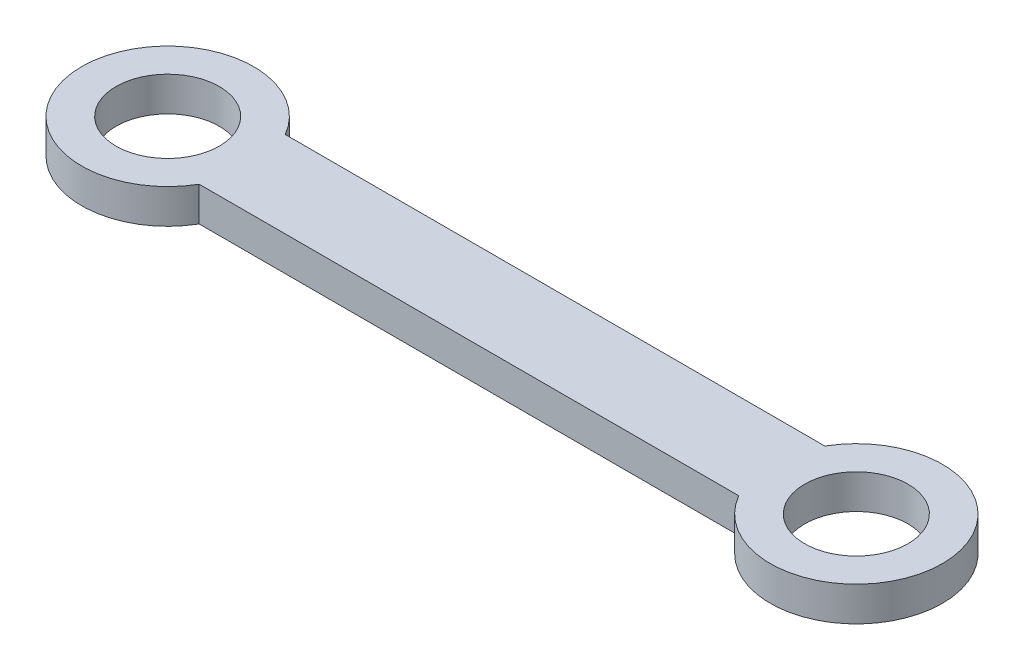
ISO-10303-21;
HEADER;
FILE_DESCRIPTION(('STEP AP214'),'2;1');
FILE_NAME('part.step','',(''),(''),'','','');
FILE_SCHEMA(('AUTOMOTIVE_DESIGN { 1 0 10303 214 1 1 1 1 }'));
ENDSEC;
DATA;
#1=APPLICATION_CONTEXT('core data for automotive mechanical design processes');
#2=APPLICATION_PROTOCOL_DEFINITION('international standard','automotive_design',2000,#1);
#3=PRODUCT_CONTEXT('',#1,'mechanical');
#4=PRODUCT('Part','Part','',(#3));
#5=PRODUCT_RELATED_PRODUCT_CATEGORY('part','',(#4));
#6=PRODUCT_DEFINITION_FORMATION('','',#4);
#7=PRODUCT_DEFINITION_CONTEXT('part definition',#1,'design');
#8=PRODUCT_DEFINITION('design','',#6,#7);
#9=PRODUCT_DEFINITION_SHAPE('','',#8);
#10=(LENGTH_UNIT() NAMED_UNIT(*) SI_UNIT(.MILLI.,.METRE.));
#11=(NAMED_UNIT(*) PLANE_ANGLE_UNIT() SI_UNIT($,.RADIAN.));
#12=(NAMED_UNIT(*) SI_UNIT($,.STERADIAN.) SOLID_ANGLE_UNIT());
#13=UNCERTAINTY_MEASURE_WITH_UNIT(LENGTH_MEASURE(1.E-05),#10,'distance_accuracy_value','');
#14=(GEOMETRIC_REPRESENTATION_CONTEXT(3) GLOBAL_UNCERTAINTY_ASSIGNED_CONTEXT((#13)) GLOBAL_UNIT_ASSIGNED_CONTEXT((#10,
#11,#12)) REPRESENTATION_CONTEXT('',''));
#15=CARTESIAN_POINT('',(0.,0.,0.));
#16=DIRECTION('',(0.,0.,1.));
#17=DIRECTION('',(1.,0.,0.));
#18=AXIS2_PLACEMENT_3D('',#15,#16,#17);
#19=CARTESIAN_POINT('',(-20.,2.,0.));
#20=DIRECTION('',(0.,1.,0.));
#21=DIRECTION('',(0.,0.,1.));
#22=AXIS2_PLACEMENT_3D('',#19,#20,#21);
#23=PLANE('',#22);
#24=CARTESIAN_POINT('',(-20.,2.,0.));
#25=DIRECTION('',(0.,1.,0.));
#26=DIRECTION('',(0.,0.,1.));
#27=AXIS2_PLACEMENT_3D('',#24,#25,#26);
#28=CIRCLE('',#27,3.);
#29=CARTESIAN_POINT('',(-20.,2.,3.));
#30=VERTEX_POINT('',#29);
#31=EDGE_CURVE('E116',#30,#30,#28,.T.);
#32=ORIENTED_EDGE('',*,*,#31,.F.);
#33=EDGE_LOOP('',(#32));
#34=FACE_BOUND('',#33,.T.);
#35=CARTESIAN_POINT('',(-20.,2.,0.));
#36=DIRECTION('',(0.,1.,0.));
#37=DIRECTION('',(0.,0.,1.));
#38=AXIS2_PLACEMENT_3D('',#35,#36,#37);
#39=CIRCLE('',#38,5.);
#40=CARTESIAN_POINT('',(-15.6698729810778,2.,-2.5));
#41=VERTEX_POINT('',#40);
#42=CARTESIAN_POINT('',(-15.6698729810778,2.,2.5));
#43=VERTEX_POINT('',#42);
#44=EDGE_CURVE('E96',#41,#43,#39,.T.);
#45=ORIENTED_EDGE('',*,*,#44,.T.);
#46=DIRECTION('',(1.,0.,0.));
#47=VECTOR('',#46,1.);
#48=CARTESIAN_POINT('',(15.6698729810778,2.,2.5));
#49=LINE('',#48,#47);
#50=CARTESIAN_POINT('',(15.6698729810778,2.,2.5));
#51=VERTEX_POINT('',#50);
#52=EDGE_CURVE('E91',#43,#51,#49,.T.);
#53=ORIENTED_EDGE('',*,*,#52,.T.);
#54=CARTESIAN_POINT('',(20.,2.,0.));
#55=DIRECTION('',(0.,1.,0.));
#56=DIRECTION('',(0.,0.,-1.));
#57=AXIS2_PLACEMENT_3D('',#54,#55,#56);
#58=CIRCLE('',#57,5.);
#59=CARTESIAN_POINT('',(15.6698729810778,2.,-2.5));
#60=VERTEX_POINT('',#59);
#61=EDGE_CURVE('E94',#51,#60,#58,.T.);
#62=ORIENTED_EDGE('',*,*,#61,.T.);
#63=DIRECTION('',(-1.,0.,0.));
#64=VECTOR('',#63,1.);
#65=CARTESIAN_POINT('',(15.6698729810778,2.,-2.5));
#66=LINE('',#65,#64);
#67=EDGE_CURVE('E61',#60,#41,#66,.T.);
#68=ORIENTED_EDGE('',*,*,#67,.T.);
#69=EDGE_LOOP('',(#45,#53,#62,#68));
#70=FACE_BOUND('',#69,.T.);
#71=CARTESIAN_POINT('',(20.,2.,0.));
#72=DIRECTION('',(0.,1.,0.));
#73=DIRECTION('',(0.,0.,-1.));
#74=AXIS2_PLACEMENT_3D('',#71,#72,#73);
#75=CIRCLE('',#74,3.);
#76=CARTESIAN_POINT('',(20.,2.,-3.));
#77=VERTEX_POINT('',#76);
#78=EDGE_CURVE('E138',#77,#77,#75,.T.);
#79=ORIENTED_EDGE('',*,*,#78,.F.);
#80=EDGE_LOOP('',(#79));
#81=FACE_BOUND('',#80,.T.);
#82=ADVANCED_FACE('F43',(#34,#70,#81),#23,.T.);
#83=CARTESIAN_POINT('',(-20.,0.,0.));
#84=DIRECTION('',(0.,1.,0.));
#85=DIRECTION('',(0.,0.,1.));
#86=AXIS2_PLACEMENT_3D('',#83,#84,#85);
#87=PLANE('',#86);
#88=CARTESIAN_POINT('',(-20.,0.,0.));
#89=DIRECTION('',(0.,1.,0.));
#90=DIRECTION('',(0.,0.,1.));
#91=AXIS2_PLACEMENT_3D('',#88,#89,#90);
#92=CIRCLE('',#91,5.);
#93=CARTESIAN_POINT('',(-15.6698729810778,0.,-2.5));
#94=VERTEX_POINT('',#93);
#95=CARTESIAN_POINT('',(-15.6698729810778,0.,2.5));
#96=VERTEX_POINT('',#95);
#97=EDGE_CURVE('E112',#94,#96,#92,.T.);
#98=ORIENTED_EDGE('',*,*,#97,.F.);
#99=DIRECTION('',(-1.,0.,0.));
#100=VECTOR('',#99,1.);
#101=CARTESIAN_POINT('',(15.6698729810778,0.,-2.5));
#102=LINE('',#101,#100);
#103=CARTESIAN_POINT('',(15.6698729810778,0.,-2.5));
#104=VERTEX_POINT('',#103);
#105=EDGE_CURVE('E84',#104,#94,#102,.T.);
#106=ORIENTED_EDGE('',*,*,#105,.F.);
#107=CARTESIAN_POINT('',(20.,0.,0.));
#108=DIRECTION('',(0.,1.,0.));
#109=DIRECTION('',(0.,0.,-1.));
#110=AXIS2_PLACEMENT_3D('',#107,#108,#109);
#111=CIRCLE('',#110,5.);
#112=CARTESIAN_POINT('',(15.6698729810778,0.,2.5));
#113=VERTEX_POINT('',#112);
#114=EDGE_CURVE('E78',#113,#104,#111,.T.);
#115=ORIENTED_EDGE('',*,*,#114,.F.);
#116=DIRECTION('',(1.,0.,0.));
#117=VECTOR('',#116,1.);
#118=CARTESIAN_POINT('',(15.6698729810778,0.,2.5));
#119=LINE('',#118,#117);
#120=EDGE_CURVE('E101',#96,#113,#119,.T.);
#121=ORIENTED_EDGE('',*,*,#120,.F.);
#122=EDGE_LOOP('',(#98,#106,#115,#121));
#123=FACE_BOUND('',#122,.T.);
#124=CARTESIAN_POINT('',(-20.,0.,0.));
#125=DIRECTION('',(0.,1.,0.));
#126=DIRECTION('',(0.,0.,1.));
#127=AXIS2_PLACEMENT_3D('',#124,#125,#126);
#128=CIRCLE('',#127,3.);
#129=CARTESIAN_POINT('',(-20.,0.,3.));
#130=VERTEX_POINT('',#129);
#131=EDGE_CURVE('E134',#130,#130,#128,.T.);
#132=ORIENTED_EDGE('',*,*,#131,.T.);
#133=EDGE_LOOP('',(#132));
#134=FACE_BOUND('',#133,.T.);
#135=CARTESIAN_POINT('',(20.,0.,0.));
#136=DIRECTION('',(0.,1.,0.));
#137=DIRECTION('',(0.,0.,-1.));
#138=AXIS2_PLACEMENT_3D('',#135,#136,#137);
#139=CIRCLE('',#138,3.);
#140=CARTESIAN_POINT('',(20.,0.,-3.));
#141=VERTEX_POINT('',#140);
#142=EDGE_CURVE('E142',#141,#141,#139,.T.);
#143=ORIENTED_EDGE('',*,*,#142,.T.);
#144=EDGE_LOOP('',(#143));
#145=FACE_BOUND('',#144,.T.);
#146=ADVANCED_FACE('F129',(#123,#134,#145),#87,.F.);
#147=CARTESIAN_POINT('',(-20.,2.,0.));
#148=DIRECTION('',(0.,-1.,0.));
#149=DIRECTION('',(0.,0.,-1.));
#150=AXIS2_PLACEMENT_3D('',#147,#148,#149);
#151=CYLINDRICAL_SURFACE('',#150,5.);
#152=ORIENTED_EDGE('',*,*,#97,.T.);
#153=DIRECTION('',(0.,-1.,0.));
#154=VECTOR('',#153,1.);
#155=CARTESIAN_POINT('',(-15.6698729810778,2.,2.5));
#156=LINE('',#155,#154);
#157=EDGE_CURVE('E11',#43,#96,#156,.T.);
#158=ORIENTED_EDGE('',*,*,#157,.F.);
#159=ORIENTED_EDGE('',*,*,#44,.F.);
#160=DIRECTION('',(0.,-1.,0.));
#161=VECTOR('',#160,1.);
#162=CARTESIAN_POINT('',(-15.6698729810778,2.,-2.5));
#163=LINE('',#162,#161);
#164=EDGE_CURVE('E108',#41,#94,#163,.T.);
#165=ORIENTED_EDGE('',*,*,#164,.T.);
#166=EDGE_LOOP('',(#152,#158,#159,#165));
#167=FACE_BOUND('',#166,.T.);
#168=ADVANCED_FACE('F45',(#167),#151,.T.);
#169=CARTESIAN_POINT('',(15.6698729810778,2.,2.5));
#170=DIRECTION('',(0.,0.,-1.));
#171=DIRECTION('',(-1.,0.,0.));
#172=AXIS2_PLACEMENT_3D('',#169,#170,#171);
#173=PLANE('',#172);
#174=ORIENTED_EDGE('',*,*,#120,.T.);
#175=DIRECTION('',(0.,-1.,0.));
#176=VECTOR('',#175,1.);
#177=CARTESIAN_POINT('',(15.6698729810778,2.,2.5));
#178=LINE('',#177,#176);
#179=EDGE_CURVE('E53',#51,#113,#178,.T.);
#180=ORIENTED_EDGE('',*,*,#179,.F.);
#181=ORIENTED_EDGE('',*,*,#52,.F.);
#182=ORIENTED_EDGE('',*,*,#157,.T.);
#183=EDGE_LOOP('',(#174,#180,#181,#182));
#184=FACE_BOUND('',#183,.T.);
#185=ADVANCED_FACE('F100',(#184),#173,.F.);
#186=CARTESIAN_POINT('',(20.,2.,0.));
#187=DIRECTION('',(0.,-1.,0.));
#188=DIRECTION('',(0.,0.,-1.));
#189=AXIS2_PLACEMENT_3D('',#186,#187,#188);
#190=CYLINDRICAL_SURFACE('',#189,5.);
#191=ORIENTED_EDGE('',*,*,#114,.T.);
#192=DIRECTION('',(0.,-1.,0.));
#193=VECTOR('',#192,1.);
#194=CARTESIAN_POINT('',(15.6698729810778,2.,-2.5));
#195=LINE('',#194,#193);
#196=EDGE_CURVE('E103',#60,#104,#195,.T.);
#197=ORIENTED_EDGE('',*,*,#196,.F.);
#198=ORIENTED_EDGE('',*,*,#61,.F.);
#199=ORIENTED_EDGE('',*,*,#179,.T.);
#200=EDGE_LOOP('',(#191,#197,#198,#199));
#201=FACE_BOUND('',#200,.T.);
#202=ADVANCED_FACE('F104',(#201),#190,.T.);
#203=CARTESIAN_POINT('',(15.6698729810778,2.,-2.5));
#204=DIRECTION('',(0.,0.,1.));
#205=DIRECTION('',(1.,0.,0.));
#206=AXIS2_PLACEMENT_3D('',#203,#204,#205);
#207=PLANE('',#206);
#208=ORIENTED_EDGE('',*,*,#105,.T.);
#209=ORIENTED_EDGE('',*,*,#164,.F.);
#210=ORIENTED_EDGE('',*,*,#67,.F.);
#211=ORIENTED_EDGE('',*,*,#196,.T.);
#212=EDGE_LOOP('',(#208,#209,#210,#211));
#213=FACE_BOUND('',#212,.T.);
#214=ADVANCED_FACE('F126',(#213),#207,.F.);
#215=CARTESIAN_POINT('',(-20.,2.,0.));
#216=DIRECTION('',(0.,-1.,0.));
#217=DIRECTION('',(0.,0.,-1.));
#218=AXIS2_PLACEMENT_3D('',#215,#216,#217);
#219=CYLINDRICAL_SURFACE('',#218,3.);
#220=ORIENTED_EDGE('',*,*,#31,.T.);
#221=EDGE_LOOP('',(#220));
#222=FACE_BOUND('',#221,.T.);
#223=ORIENTED_EDGE('',*,*,#131,.F.);
#224=EDGE_LOOP('',(#223));
#225=FACE_BOUND('',#224,.T.);
#226=ADVANCED_FACE('F161',(#222,#225),#219,.F.);
#227=CARTESIAN_POINT('',(20.,2.,0.));
#228=DIRECTION('',(0.,-1.,0.));
#229=DIRECTION('',(0.,0.,-1.));
#230=AXIS2_PLACEMENT_3D('',#227,#228,#229);
#231=CYLINDRICAL_SURFACE('',#230,3.);
#232=ORIENTED_EDGE('',*,*,#78,.T.);
#233=EDGE_LOOP('',(#232));
#234=FACE_BOUND('',#233,.T.);
#235=ORIENTED_EDGE('',*,*,#142,.F.);
#236=EDGE_LOOP('',(#235));
#237=FACE_BOUND('',#236,.T.);
#238=ADVANCED_FACE('F150',(#234,#237),#231,.F.);
#239=CLOSED_SHELL('',(#82,#146,#168,#185,#202,#214,#226,#238));
#240=MANIFOLD_SOLID_BREP('B2',#239);
#241=ADVANCED_BREP_SHAPE_REPRESENTATION('',(#18,#240),#14);
#242=SHAPE_DEFINITION_REPRESENTATION(#9,#241);
ENDSEC;
END-ISO-10303-21;
